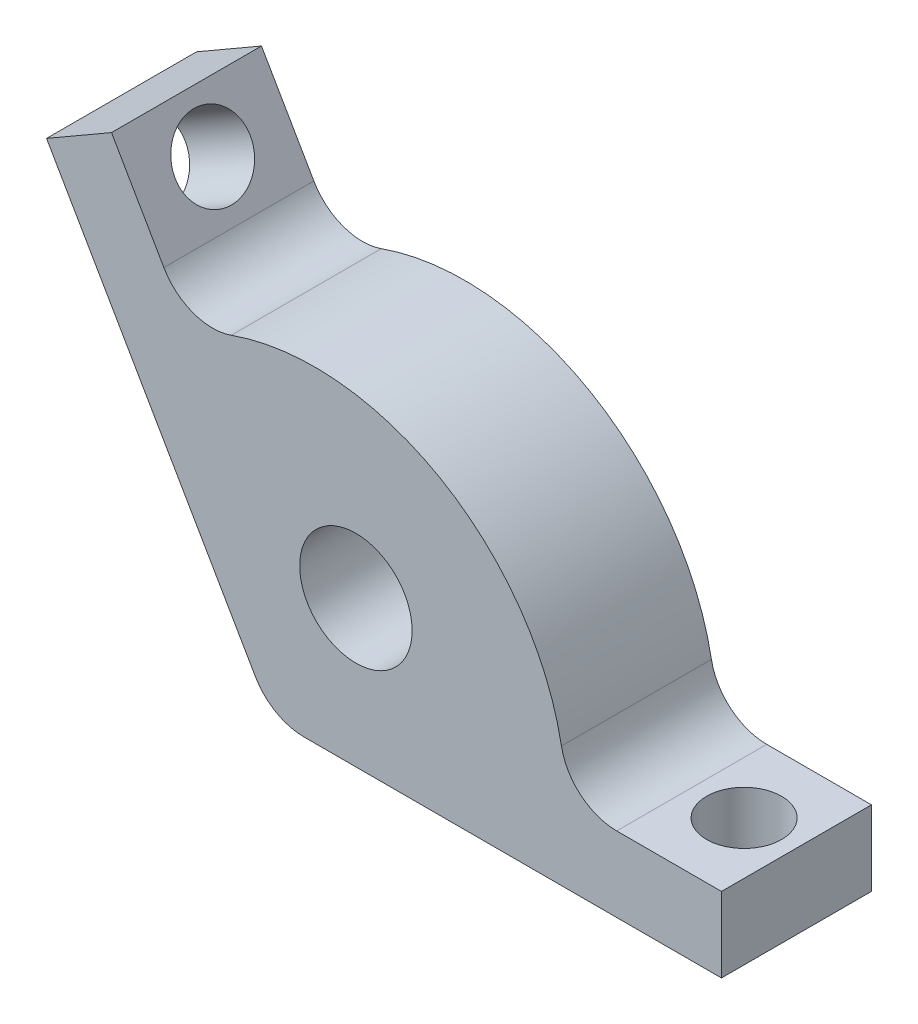
ISO-10303-21;
HEADER;
FILE_DESCRIPTION(('STEP AP214'),'2;1');
FILE_NAME('part.step','',(''),(''),'','','');
FILE_SCHEMA(('AUTOMOTIVE_DESIGN { 1 0 10303 214 1 1 1 1 }'));
ENDSEC;
DATA;
#1=APPLICATION_CONTEXT('core data for automotive mechanical design processes');
#2=APPLICATION_PROTOCOL_DEFINITION('international standard','automotive_design',2000,#1);
#3=PRODUCT_CONTEXT('',#1,'mechanical');
#4=PRODUCT('Part','Part','',(#3));
#5=PRODUCT_RELATED_PRODUCT_CATEGORY('part','',(#4));
#6=PRODUCT_DEFINITION_FORMATION('','',#4);
#7=PRODUCT_DEFINITION_CONTEXT('part definition',#1,'design');
#8=PRODUCT_DEFINITION('design','',#6,#7);
#9=PRODUCT_DEFINITION_SHAPE('','',#8);
#10=(LENGTH_UNIT() NAMED_UNIT(*) SI_UNIT(.MILLI.,.METRE.));
#11=(NAMED_UNIT(*) PLANE_ANGLE_UNIT() SI_UNIT($,.RADIAN.));
#12=(NAMED_UNIT(*) SI_UNIT($,.STERADIAN.) SOLID_ANGLE_UNIT());
#13=UNCERTAINTY_MEASURE_WITH_UNIT(LENGTH_MEASURE(1.E-05),#10,'distance_accuracy_value','');
#14=(GEOMETRIC_REPRESENTATION_CONTEXT(3) GLOBAL_UNCERTAINTY_ASSIGNED_CONTEXT((#13)) GLOBAL_UNIT_ASSIGNED_CONTEXT((#10,
#11,#12)) REPRESENTATION_CONTEXT('',''));
#15=CARTESIAN_POINT('',(0.,0.,0.));
#16=DIRECTION('',(0.,0.,1.));
#17=DIRECTION('',(1.,0.,0.));
#18=AXIS2_PLACEMENT_3D('',#15,#16,#17);
#19=CARTESIAN_POINT('',(1.83308710467705,3.17499999999999,6.35));
#20=DIRECTION('',(0.,0.,-1.));
#21=DIRECTION('',(-1.,0.,0.));
#22=AXIS2_PLACEMENT_3D('',#19,#20,#21);
#23=PLANE('',#22);
#24=DIRECTION('',(0.500000000000004,-0.866025403784436,0.));
#25=VECTOR('',#24,1.);
#26=CARTESIAN_POINT('',(0.,0.,6.35));
#27=LINE('',#26,#25);
#28=CARTESIAN_POINT('',(-9.52500000000007,16.4977839420935,6.35));
#29=VERTEX_POINT('',#28);
#30=CARTESIAN_POINT('',(-0.6874076642539,1.19062499999999,6.35));
#31=VERTEX_POINT('',#30);
#32=EDGE_CURVE('E122',#29,#31,#27,.T.);
#33=ORIENTED_EDGE('',*,*,#32,.T.);
#34=CARTESIAN_POINT('',(1.37481532850779,2.38125,6.35));
#35=DIRECTION('',(0.,0.,-1.));
#36=DIRECTION('',(-1.,0.,0.));
#37=AXIS2_PLACEMENT_3D('',#34,#35,#36);
#38=CIRCLE('',#37,2.38125);
#39=CARTESIAN_POINT('',(1.37481532850779,0.,6.35));
#40=VERTEX_POINT('',#39);
#41=EDGE_CURVE('E118',#31,#40,#38,.F.);
#42=ORIENTED_EDGE('',*,*,#41,.T.);
#43=DIRECTION('',(1.,0.,0.));
#44=VECTOR('',#43,1.);
#45=CARTESIAN_POINT('',(0.,0.,6.35));
#46=LINE('',#45,#44);
#47=CARTESIAN_POINT('',(19.05,0.,6.35));
#48=VERTEX_POINT('',#47);
#49=EDGE_CURVE('E109',#40,#48,#46,.T.);
#50=ORIENTED_EDGE('',*,*,#49,.T.);
#51=DIRECTION('',(0.,1.,0.));
#52=VECTOR('',#51,1.);
#53=CARTESIAN_POINT('',(19.05,0.,6.35));
#54=LINE('',#53,#52);
#55=CARTESIAN_POINT('',(19.05,3.175,6.35));
#56=VERTEX_POINT('',#55);
#57=EDGE_CURVE('E115',#48,#56,#54,.T.);
#58=ORIENTED_EDGE('',*,*,#57,.T.);
#59=DIRECTION('',(-1.,0.,0.));
#60=VECTOR('',#59,1.);
#61=CARTESIAN_POINT('',(19.05,3.175,6.35));
#62=LINE('',#61,#60);
#63=CARTESIAN_POINT('',(14.6157560602978,3.175,6.35));
#64=VERTEX_POINT('',#63);
#65=EDGE_CURVE('E137',#56,#64,#62,.T.);
#66=ORIENTED_EDGE('',*,*,#65,.T.);
#67=CARTESIAN_POINT('',(14.6157560602978,5.55625,6.35));
#68=DIRECTION('',(0.,0.,-1.));
#69=DIRECTION('',(-1.,0.,0.));
#70=AXIS2_PLACEMENT_3D('',#67,#68,#69);
#71=CIRCLE('',#70,2.38125);
#72=CARTESIAN_POINT('',(12.2747790922981,5.120155517353,6.35));
#73=VERTEX_POINT('',#72);
#74=EDGE_CURVE('E188',#64,#73,#71,.T.);
#75=ORIENTED_EDGE('',*,*,#74,.T.);
#76=CARTESIAN_POINT('',(1.83308710467705,3.17499999999999,6.35));
#77=DIRECTION('',(0.,0.,1.));
#78=DIRECTION('',(-1.,0.,0.));
#79=AXIS2_PLACEMENT_3D('',#76,#77,#78);
#80=CIRCLE('',#79,10.6213257906459);
#81=CARTESIAN_POINT('',(-1.70320479679437,13.1903482784488,6.35));
#82=VERTEX_POINT('',#81);
#83=EDGE_CURVE('E139',#73,#82,#80,.T.);
#84=ORIENTED_EDGE('',*,*,#83,.T.);
#85=CARTESIAN_POINT('',(-2.49602438037168,15.4357410437342,6.35));
#86=DIRECTION('',(0.,0.,-1.));
#87=DIRECTION('',(-1.,0.,0.));
#88=AXIS2_PLACEMENT_3D('',#85,#86,#87);
#89=CIRCLE('',#88,2.38125);
#90=CARTESIAN_POINT('',(-4.55824737313336,14.2451160437342,6.35));
#91=VERTEX_POINT('',#90);
#92=EDGE_CURVE('E11',#82,#91,#89,.T.);
#93=ORIENTED_EDGE('',*,*,#92,.T.);
#94=DIRECTION('',(-0.500000000000004,0.866025403784436,0.));
#95=VECTOR('',#94,1.);
#96=CARTESIAN_POINT('',(-6.77536934298449,18.0852839420935,6.35));
#97=LINE('',#96,#95);
#98=CARTESIAN_POINT('',(-6.77536934298449,18.0852839420935,6.35));
#99=VERTEX_POINT('',#98);
#100=EDGE_CURVE('E144',#91,#99,#97,.T.);
#101=ORIENTED_EDGE('',*,*,#100,.T.);
#102=DIRECTION('',(-0.866025403784436,-0.500000000000004,0.));
#103=VECTOR('',#102,1.);
#104=CARTESIAN_POINT('',(-9.52500000000007,16.4977839420935,6.35));
#105=LINE('',#104,#103);
#106=EDGE_CURVE('E146',#99,#29,#105,.T.);
#107=ORIENTED_EDGE('',*,*,#106,.T.);
#108=EDGE_LOOP('',(#33,#42,#50,#58,#66,#75,#84,#93,#101,#107));
#109=FACE_BOUND('',#108,.T.);
#110=CARTESIAN_POINT('',(3.57187499999999,6.18666897828509,6.35));
#111=DIRECTION('',(0.,0.,1.));
#112=DIRECTION('',(1.,0.,0.));
#113=AXIS2_PLACEMENT_3D('',#110,#111,#112);
#114=CIRCLE('',#113,2.38125);
#115=CARTESIAN_POINT('',(5.95312499999999,6.18666897828509,6.35));
#116=VERTEX_POINT('',#115);
#117=EDGE_CURVE('E152',#116,#116,#114,.T.);
#118=ORIENTED_EDGE('',*,*,#117,.F.);
#119=EDGE_LOOP('',(#118));
#120=FACE_BOUND('',#119,.T.);
#121=ADVANCED_FACE('F33',(#109,#120),#23,.F.);
#122=CARTESIAN_POINT('',(1.83308710467705,3.17499999999999,0.));
#123=DIRECTION('',(0.,0.,-1.));
#124=DIRECTION('',(-1.,0.,0.));
#125=AXIS2_PLACEMENT_3D('',#122,#123,#124);
#126=PLANE('',#125);
#127=DIRECTION('',(1.,0.,0.));
#128=VECTOR('',#127,1.);
#129=CARTESIAN_POINT('',(0.,0.,0.));
#130=LINE('',#129,#128);
#131=CARTESIAN_POINT('',(1.37481532850779,0.,0.));
#132=VERTEX_POINT('',#131);
#133=CARTESIAN_POINT('',(19.05,0.,0.));
#134=VERTEX_POINT('',#133);
#135=EDGE_CURVE('E128',#132,#134,#130,.T.);
#136=ORIENTED_EDGE('',*,*,#135,.F.);
#137=CARTESIAN_POINT('',(1.37481532850779,2.38125,0.));
#138=DIRECTION('',(0.,0.,-1.));
#139=DIRECTION('',(-1.,0.,0.));
#140=AXIS2_PLACEMENT_3D('',#137,#138,#139);
#141=CIRCLE('',#140,2.38125);
#142=CARTESIAN_POINT('',(-0.6874076642539,1.19062499999999,0.));
#143=VERTEX_POINT('',#142);
#144=EDGE_CURVE('E172',#132,#143,#141,.T.);
#145=ORIENTED_EDGE('',*,*,#144,.T.);
#146=DIRECTION('',(0.500000000000004,-0.866025403784436,0.));
#147=VECTOR('',#146,1.);
#148=CARTESIAN_POINT('',(0.,0.,0.));
#149=LINE('',#148,#147);
#150=CARTESIAN_POINT('',(-9.52500000000007,16.4977839420935,0.));
#151=VERTEX_POINT('',#150);
#152=EDGE_CURVE('E149',#151,#143,#149,.T.);
#153=ORIENTED_EDGE('',*,*,#152,.F.);
#154=DIRECTION('',(-0.866025403784436,-0.500000000000004,0.));
#155=VECTOR('',#154,1.);
#156=CARTESIAN_POINT('',(-9.52500000000007,16.4977839420935,0.));
#157=LINE('',#156,#155);
#158=CARTESIAN_POINT('',(-6.77536934298449,18.0852839420935,0.));
#159=VERTEX_POINT('',#158);
#160=EDGE_CURVE('E163',#159,#151,#157,.T.);
#161=ORIENTED_EDGE('',*,*,#160,.F.);
#162=DIRECTION('',(-0.500000000000004,0.866025403784436,0.));
#163=VECTOR('',#162,1.);
#164=CARTESIAN_POINT('',(-6.77536934298449,18.0852839420935,0.));
#165=LINE('',#164,#163);
#166=CARTESIAN_POINT('',(-4.55824737313336,14.2451160437342,0.));
#167=VERTEX_POINT('',#166);
#168=EDGE_CURVE('E161',#167,#159,#165,.T.);
#169=ORIENTED_EDGE('',*,*,#168,.F.);
#170=CARTESIAN_POINT('',(-2.49602438037168,15.4357410437342,0.));
#171=DIRECTION('',(0.,0.,-1.));
#172=DIRECTION('',(-1.,0.,0.));
#173=AXIS2_PLACEMENT_3D('',#170,#171,#172);
#174=CIRCLE('',#173,2.38125);
#175=CARTESIAN_POINT('',(-1.70320479679437,13.1903482784488,0.));
#176=VERTEX_POINT('',#175);
#177=EDGE_CURVE('E42',#167,#176,#174,.F.);
#178=ORIENTED_EDGE('',*,*,#177,.T.);
#179=CARTESIAN_POINT('',(1.83308710467705,3.17499999999999,0.));
#180=DIRECTION('',(0.,0.,1.));
#181=DIRECTION('',(-1.,0.,0.));
#182=AXIS2_PLACEMENT_3D('',#179,#180,#181);
#183=CIRCLE('',#182,10.6213257906459);
#184=CARTESIAN_POINT('',(12.2747790922981,5.120155517353,0.));
#185=VERTEX_POINT('',#184);
#186=EDGE_CURVE('E159',#185,#176,#183,.T.);
#187=ORIENTED_EDGE('',*,*,#186,.F.);
#188=CARTESIAN_POINT('',(14.6157560602978,5.55625,0.));
#189=DIRECTION('',(0.,0.,-1.));
#190=DIRECTION('',(-1.,0.,0.));
#191=AXIS2_PLACEMENT_3D('',#188,#189,#190);
#192=CIRCLE('',#191,2.38125);
#193=CARTESIAN_POINT('',(14.6157560602978,3.175,0.));
#194=VERTEX_POINT('',#193);
#195=EDGE_CURVE('E186',#185,#194,#192,.F.);
#196=ORIENTED_EDGE('',*,*,#195,.T.);
#197=DIRECTION('',(-1.,0.,0.));
#198=VECTOR('',#197,1.);
#199=CARTESIAN_POINT('',(19.05,3.175,0.));
#200=LINE('',#199,#198);
#201=CARTESIAN_POINT('',(19.05,3.175,0.));
#202=VERTEX_POINT('',#201);
#203=EDGE_CURVE('E156',#202,#194,#200,.T.);
#204=ORIENTED_EDGE('',*,*,#203,.F.);
#205=DIRECTION('',(0.,1.,0.));
#206=VECTOR('',#205,1.);
#207=CARTESIAN_POINT('',(19.05,0.,0.));
#208=LINE('',#207,#206);
#209=EDGE_CURVE('E154',#134,#202,#208,.T.);
#210=ORIENTED_EDGE('',*,*,#209,.F.);
#211=EDGE_LOOP('',(#136,#145,#153,#161,#169,#178,#187,#196,#204,#210));
#212=FACE_BOUND('',#211,.T.);
#213=CARTESIAN_POINT('',(3.57187499999999,6.18666897828509,0.));
#214=DIRECTION('',(0.,0.,1.));
#215=DIRECTION('',(1.,0.,0.));
#216=AXIS2_PLACEMENT_3D('',#213,#214,#215);
#217=CIRCLE('',#216,2.38125);
#218=CARTESIAN_POINT('',(5.95312499999999,6.18666897828509,0.));
#219=VERTEX_POINT('',#218);
#220=EDGE_CURVE('E213',#219,#219,#217,.T.);
#221=ORIENTED_EDGE('',*,*,#220,.T.);
#222=EDGE_LOOP('',(#221));
#223=FACE_BOUND('',#222,.T.);
#224=ADVANCED_FACE('F193',(#212,#223),#126,.T.);
#225=CARTESIAN_POINT('',(0.,0.,6.35));
#226=DIRECTION('',(0.866025403784436,0.500000000000004,0.));
#227=DIRECTION('',(-0.500000000000004,0.866025403784436,0.));
#228=AXIS2_PLACEMENT_3D('',#225,#226,#227);
#229=PLANE('',#228);
#230=CARTESIAN_POINT('',(-8.41643901507451,14.5776999929139,3.175));
#231=DIRECTION('',(0.866025403784436,0.500000000000004,0.));
#232=DIRECTION('',(-0.500000000000004,0.866025403784436,0.));
#233=AXIS2_PLACEMENT_3D('',#230,#231,#232);
#234=CIRCLE('',#233,1.5875);
#235=CARTESIAN_POINT('',(-9.21018901507452,15.9525153214217,3.175));
#236=VERTEX_POINT('',#235);
#237=EDGE_CURVE('E222',#236,#236,#234,.T.);
#238=ORIENTED_EDGE('',*,*,#237,.T.);
#239=EDGE_LOOP('',(#238));
#240=FACE_BOUND('',#239,.T.);
#241=ORIENTED_EDGE('',*,*,#152,.T.);
#242=DIRECTION('',(0.,0.,-1.));
#243=VECTOR('',#242,1.);
#244=CARTESIAN_POINT('',(-0.6874076642539,1.19062499999999,6.35));
#245=LINE('',#244,#243);
#246=EDGE_CURVE('E174',#143,#31,#245,.F.);
#247=ORIENTED_EDGE('',*,*,#246,.T.);
#248=ORIENTED_EDGE('',*,*,#32,.F.);
#249=DIRECTION('',(0.,0.,-1.));
#250=VECTOR('',#249,1.);
#251=CARTESIAN_POINT('',(-9.52500000000007,16.4977839420935,6.35));
#252=LINE('',#251,#250);
#253=EDGE_CURVE('E148',#29,#151,#252,.T.);
#254=ORIENTED_EDGE('',*,*,#253,.T.);
#255=EDGE_LOOP('',(#241,#247,#248,#254));
#256=FACE_BOUND('',#255,.T.);
#257=ADVANCED_FACE('F210',(#240,#256),#229,.F.);
#258=CARTESIAN_POINT('',(0.,0.,6.35));
#259=DIRECTION('',(0.,1.,0.));
#260=DIRECTION('',(0.,0.,1.));
#261=AXIS2_PLACEMENT_3D('',#258,#259,#260);
#262=PLANE('',#261);
#263=CARTESIAN_POINT('',(16.8328780301489,0.,3.175));
#264=DIRECTION('',(0.,1.,0.));
#265=DIRECTION('',(-1.,0.,0.));
#266=AXIS2_PLACEMENT_3D('',#263,#264,#265);
#267=CIRCLE('',#266,1.5875);
#268=CARTESIAN_POINT('',(15.2453780301489,0.,3.175));
#269=VERTEX_POINT('',#268);
#270=EDGE_CURVE('E216',#269,#269,#267,.T.);
#271=ORIENTED_EDGE('',*,*,#270,.T.);
#272=EDGE_LOOP('',(#271));
#273=FACE_BOUND('',#272,.T.);
#274=ORIENTED_EDGE('',*,*,#49,.F.);
#275=DIRECTION('',(0.,0.,-1.));
#276=VECTOR('',#275,1.);
#277=CARTESIAN_POINT('',(1.37481532850779,0.,6.35));
#278=LINE('',#277,#276);
#279=EDGE_CURVE('E131',#40,#132,#278,.T.);
#280=ORIENTED_EDGE('',*,*,#279,.T.);
#281=ORIENTED_EDGE('',*,*,#135,.T.);
#282=DIRECTION('',(0.,0.,-1.));
#283=VECTOR('',#282,1.);
#284=CARTESIAN_POINT('',(19.05,0.,6.35));
#285=LINE('',#284,#283);
#286=EDGE_CURVE('E125',#48,#134,#285,.T.);
#287=ORIENTED_EDGE('',*,*,#286,.F.);
#288=EDGE_LOOP('',(#274,#280,#281,#287));
#289=FACE_BOUND('',#288,.T.);
#290=ADVANCED_FACE('F126',(#273,#289),#262,.F.);
#291=CARTESIAN_POINT('',(19.05,0.,6.35));
#292=DIRECTION('',(-1.,0.,0.));
#293=DIRECTION('',(0.,0.,1.));
#294=AXIS2_PLACEMENT_3D('',#291,#292,#293);
#295=PLANE('',#294);
#296=ORIENTED_EDGE('',*,*,#209,.T.);
#297=DIRECTION('',(0.,0.,-1.));
#298=VECTOR('',#297,1.);
#299=CARTESIAN_POINT('',(19.05,3.175,6.35));
#300=LINE('',#299,#298);
#301=EDGE_CURVE('E132',#56,#202,#300,.T.);
#302=ORIENTED_EDGE('',*,*,#301,.F.);
#303=ORIENTED_EDGE('',*,*,#57,.F.);
#304=ORIENTED_EDGE('',*,*,#286,.T.);
#305=EDGE_LOOP('',(#296,#302,#303,#304));
#306=FACE_BOUND('',#305,.T.);
#307=ADVANCED_FACE('F134',(#306),#295,.F.);
#308=CARTESIAN_POINT('',(19.05,3.175,6.35));
#309=DIRECTION('',(0.,-1.,0.));
#310=DIRECTION('',(1.,0.,0.));
#311=AXIS2_PLACEMENT_3D('',#308,#309,#310);
#312=PLANE('',#311);
#313=CARTESIAN_POINT('',(16.8328780301489,3.17499999999999,3.175));
#314=DIRECTION('',(0.,1.,0.));
#315=DIRECTION('',(-1.,0.,0.));
#316=AXIS2_PLACEMENT_3D('',#313,#314,#315);
#317=CIRCLE('',#316,1.5875);
#318=CARTESIAN_POINT('',(15.2453780301489,3.17499999999999,3.175));
#319=VERTEX_POINT('',#318);
#320=EDGE_CURVE('E219',#319,#319,#317,.T.);
#321=ORIENTED_EDGE('',*,*,#320,.F.);
#322=EDGE_LOOP('',(#321));
#323=FACE_BOUND('',#322,.T.);
#324=ORIENTED_EDGE('',*,*,#203,.T.);
#325=DIRECTION('',(0.,0.,1.));
#326=VECTOR('',#325,1.);
#327=CARTESIAN_POINT('',(14.6157560602978,3.175,6.35));
#328=LINE('',#327,#326);
#329=EDGE_CURVE('E181',#194,#64,#328,.T.);
#330=ORIENTED_EDGE('',*,*,#329,.T.);
#331=ORIENTED_EDGE('',*,*,#65,.F.);
#332=ORIENTED_EDGE('',*,*,#301,.T.);
#333=EDGE_LOOP('',(#324,#330,#331,#332));
#334=FACE_BOUND('',#333,.T.);
#335=ADVANCED_FACE('F257',(#323,#334),#312,.F.);
#336=CARTESIAN_POINT('',(1.83308710467705,3.17499999999999,6.35));
#337=DIRECTION('',(0.,0.,-1.));
#338=DIRECTION('',(-1.,0.,0.));
#339=AXIS2_PLACEMENT_3D('',#336,#337,#338);
#340=CYLINDRICAL_SURFACE('',#339,10.6213257906459);
#341=ORIENTED_EDGE('',*,*,#83,.F.);
#342=DIRECTION('',(0.,0.,-1.));
#343=VECTOR('',#342,1.);
#344=CARTESIAN_POINT('',(12.2747790922981,5.120155517353,6.35));
#345=LINE('',#344,#343);
#346=EDGE_CURVE('E178',#73,#185,#345,.T.);
#347=ORIENTED_EDGE('',*,*,#346,.T.);
#348=ORIENTED_EDGE('',*,*,#186,.T.);
#349=DIRECTION('',(0.,0.,-1.));
#350=VECTOR('',#349,1.);
#351=CARTESIAN_POINT('',(-1.70320479679437,13.1903482784488,6.35));
#352=LINE('',#351,#350);
#353=EDGE_CURVE('E55',#176,#82,#352,.F.);
#354=ORIENTED_EDGE('',*,*,#353,.T.);
#355=EDGE_LOOP('',(#341,#347,#348,#354));
#356=FACE_BOUND('',#355,.T.);
#357=ADVANCED_FACE('F198',(#356),#340,.T.);
#358=CARTESIAN_POINT('',(-6.77536934298449,18.0852839420935,6.35));
#359=DIRECTION('',(-0.866025403784436,-0.500000000000004,0.));
#360=DIRECTION('',(0.500000000000004,-0.866025403784436,0.));
#361=AXIS2_PLACEMENT_3D('',#358,#359,#360);
#362=PLANE('',#361);
#363=CARTESIAN_POINT('',(-5.66680835805894,16.1651999929139,3.175));
#364=DIRECTION('',(-0.866025403784436,-0.500000000000004,0.));
#365=DIRECTION('',(0.500000000000004,-0.866025403784436,0.));
#366=AXIS2_PLACEMENT_3D('',#363,#364,#365);
#367=CIRCLE('',#366,1.5875);
#368=CARTESIAN_POINT('',(-4.87305835805893,14.7903846644061,3.175));
#369=VERTEX_POINT('',#368);
#370=EDGE_CURVE('E37',#369,#369,#367,.T.);
#371=ORIENTED_EDGE('',*,*,#370,.T.);
#372=EDGE_LOOP('',(#371));
#373=FACE_BOUND('',#372,.T.);
#374=ORIENTED_EDGE('',*,*,#100,.F.);
#375=DIRECTION('',(0.,0.,1.));
#376=VECTOR('',#375,1.);
#377=CARTESIAN_POINT('',(-4.55824737313337,14.2451160437342,0.));
#378=LINE('',#377,#376);
#379=EDGE_CURVE('E183',#91,#167,#378,.F.);
#380=ORIENTED_EDGE('',*,*,#379,.T.);
#381=ORIENTED_EDGE('',*,*,#168,.T.);
#382=DIRECTION('',(0.,0.,-1.));
#383=VECTOR('',#382,1.);
#384=CARTESIAN_POINT('',(-6.77536934298449,18.0852839420935,6.35));
#385=LINE('',#384,#383);
#386=EDGE_CURVE('E167',#99,#159,#385,.T.);
#387=ORIENTED_EDGE('',*,*,#386,.F.);
#388=EDGE_LOOP('',(#374,#380,#381,#387));
#389=FACE_BOUND('',#388,.T.);
#390=ADVANCED_FACE('F201',(#373,#389),#362,.F.);
#391=CARTESIAN_POINT('',(-9.52500000000007,16.4977839420935,6.35));
#392=DIRECTION('',(0.500000000000004,-0.866025403784436,0.));
#393=DIRECTION('',(0.866025403784436,0.500000000000004,0.));
#394=AXIS2_PLACEMENT_3D('',#391,#392,#393);
#395=PLANE('',#394);
#396=ORIENTED_EDGE('',*,*,#160,.T.);
#397=ORIENTED_EDGE('',*,*,#253,.F.);
#398=ORIENTED_EDGE('',*,*,#106,.F.);
#399=ORIENTED_EDGE('',*,*,#386,.T.);
#400=EDGE_LOOP('',(#396,#397,#398,#399));
#401=FACE_BOUND('',#400,.T.);
#402=ADVANCED_FACE('F207',(#401),#395,.F.);
#403=CARTESIAN_POINT('',(3.57187499999999,6.18666897828509,6.35));
#404=DIRECTION('',(0.,0.,-1.));
#405=DIRECTION('',(-1.,0.,0.));
#406=AXIS2_PLACEMENT_3D('',#403,#404,#405);
#407=CYLINDRICAL_SURFACE('',#406,2.38125);
#408=ORIENTED_EDGE('',*,*,#117,.T.);
#409=EDGE_LOOP('',(#408));
#410=FACE_BOUND('',#409,.T.);
#411=ORIENTED_EDGE('',*,*,#220,.F.);
#412=EDGE_LOOP('',(#411));
#413=FACE_BOUND('',#412,.T.);
#414=ADVANCED_FACE('F249',(#410,#413),#407,.F.);
#415=CARTESIAN_POINT('',(1.37481532850779,2.38125,6.35));
#416=DIRECTION('',(0.,0.,-1.));
#417=DIRECTION('',(-1.,0.,0.));
#418=AXIS2_PLACEMENT_3D('',#415,#416,#417);
#419=CYLINDRICAL_SURFACE('',#418,2.38125);
#420=ORIENTED_EDGE('',*,*,#41,.F.);
#421=ORIENTED_EDGE('',*,*,#246,.F.);
#422=ORIENTED_EDGE('',*,*,#144,.F.);
#423=ORIENTED_EDGE('',*,*,#279,.F.);
#424=EDGE_LOOP('',(#420,#421,#422,#423));
#425=FACE_BOUND('',#424,.T.);
#426=ADVANCED_FACE('F268',(#425),#419,.T.);
#427=CARTESIAN_POINT('',(14.6157560602978,5.55625,6.35));
#428=DIRECTION('',(0.,0.,-1.));
#429=DIRECTION('',(-1.,0.,0.));
#430=AXIS2_PLACEMENT_3D('',#427,#428,#429);
#431=CYLINDRICAL_SURFACE('',#430,2.38125);
#432=ORIENTED_EDGE('',*,*,#74,.F.);
#433=ORIENTED_EDGE('',*,*,#329,.F.);
#434=ORIENTED_EDGE('',*,*,#195,.F.);
#435=ORIENTED_EDGE('',*,*,#346,.F.);
#436=EDGE_LOOP('',(#432,#433,#434,#435));
#437=FACE_BOUND('',#436,.T.);
#438=ADVANCED_FACE('F270',(#437),#431,.F.);
#439=CARTESIAN_POINT('',(-2.49602438037168,15.4357410437342,6.35));
#440=DIRECTION('',(0.,0.,-1.));
#441=DIRECTION('',(-1.,0.,0.));
#442=AXIS2_PLACEMENT_3D('',#439,#440,#441);
#443=CYLINDRICAL_SURFACE('',#442,2.38125);
#444=ORIENTED_EDGE('',*,*,#92,.F.);
#445=ORIENTED_EDGE('',*,*,#353,.F.);
#446=ORIENTED_EDGE('',*,*,#177,.F.);
#447=ORIENTED_EDGE('',*,*,#379,.F.);
#448=EDGE_LOOP('',(#444,#445,#446,#447));
#449=FACE_BOUND('',#448,.T.);
#450=ADVANCED_FACE('F35',(#449),#443,.F.);
#451=CARTESIAN_POINT('',(16.8328780301489,0.,3.175));
#452=DIRECTION('',(0.,1.,0.));
#453=DIRECTION('',(-1.,0.,0.));
#454=AXIS2_PLACEMENT_3D('',#451,#452,#453);
#455=CYLINDRICAL_SURFACE('',#454,1.5875);
#456=ORIENTED_EDGE('',*,*,#270,.F.);
#457=EDGE_LOOP('',(#456));
#458=FACE_BOUND('',#457,.T.);
#459=ORIENTED_EDGE('',*,*,#320,.T.);
#460=EDGE_LOOP('',(#459));
#461=FACE_BOUND('',#460,.T.);
#462=ADVANCED_FACE('F235',(#458,#461),#455,.F.);
#463=CARTESIAN_POINT('',(13.7022186491793,27.3479129494842,3.175));
#464=DIRECTION('',(-0.866025403784436,-0.500000000000004,0.));
#465=DIRECTION('',(0.500000000000005,-0.866025403784436,0.));
#466=AXIS2_PLACEMENT_3D('',#463,#464,#465);
#467=CYLINDRICAL_SURFACE('',#466,1.5875);
#468=ORIENTED_EDGE('',*,*,#370,.F.);
#469=EDGE_LOOP('',(#468));
#470=FACE_BOUND('',#469,.T.);
#471=ORIENTED_EDGE('',*,*,#237,.F.);
#472=EDGE_LOOP('',(#471));
#473=FACE_BOUND('',#472,.T.);
#474=ADVANCED_FACE('F232',(#470,#473),#467,.F.);
#475=CLOSED_SHELL('',(#121,#224,#257,#290,#307,#335,#357,#390,#402,#414,#426,#438,#450,#462,#474));
#476=MANIFOLD_SOLID_BREP('B2',#475);
#477=ADVANCED_BREP_SHAPE_REPRESENTATION('',(#18,#476),#14);
#478=SHAPE_DEFINITION_REPRESENTATION(#9,#477);
ENDSEC;
END-ISO-10303-21;
